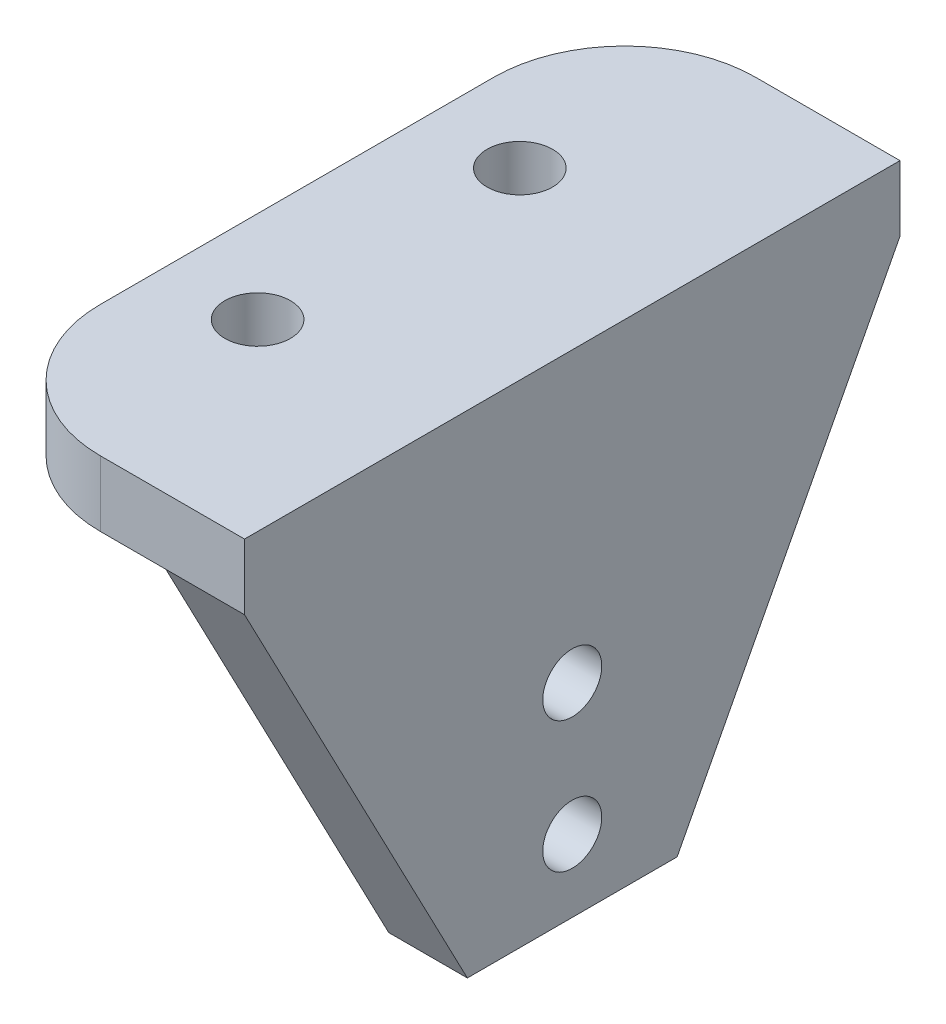
ISO-10303-21;
HEADER;
FILE_DESCRIPTION(('STEP AP214'),'2;1');
FILE_NAME('part.step','',(''),(''),'','','');
FILE_SCHEMA(('AUTOMOTIVE_DESIGN { 1 0 10303 214 1 1 1 1 }'));
ENDSEC;
DATA;
#1=APPLICATION_CONTEXT('core data for automotive mechanical design processes');
#2=APPLICATION_PROTOCOL_DEFINITION('international standard','automotive_design',2000,#1);
#3=PRODUCT_CONTEXT('',#1,'mechanical');
#4=PRODUCT('Part','Part','',(#3));
#5=PRODUCT_RELATED_PRODUCT_CATEGORY('part','',(#4));
#6=PRODUCT_DEFINITION_FORMATION('','',#4);
#7=PRODUCT_DEFINITION_CONTEXT('part definition',#1,'design');
#8=PRODUCT_DEFINITION('design','',#6,#7);
#9=PRODUCT_DEFINITION_SHAPE('','',#8);
#10=(LENGTH_UNIT() NAMED_UNIT(*) SI_UNIT(.MILLI.,.METRE.));
#11=(NAMED_UNIT(*) PLANE_ANGLE_UNIT() SI_UNIT($,.RADIAN.));
#12=(NAMED_UNIT(*) SI_UNIT($,.STERADIAN.) SOLID_ANGLE_UNIT());
#13=UNCERTAINTY_MEASURE_WITH_UNIT(LENGTH_MEASURE(1.E-05),#10,'distance_accuracy_value','');
#14=(GEOMETRIC_REPRESENTATION_CONTEXT(3) GLOBAL_UNCERTAINTY_ASSIGNED_CONTEXT((#13)) GLOBAL_UNIT_ASSIGNED_CONTEXT((#10,
#11,#12)) REPRESENTATION_CONTEXT('',''));
#15=CARTESIAN_POINT('',(0.,0.,0.));
#16=DIRECTION('',(0.,0.,1.));
#17=DIRECTION('',(1.,0.,0.));
#18=AXIS2_PLACEMENT_3D('',#15,#16,#17);
#19=CARTESIAN_POINT('',(0.,5.,0.));
#20=DIRECTION('',(1.,0.,0.));
#21=DIRECTION('',(0.,0.,-1.));
#22=AXIS2_PLACEMENT_3D('',#19,#20,#21);
#23=PLANE('',#22);
#24=DIRECTION('',(0.,0.,1.));
#25=VECTOR('',#24,1.);
#26=CARTESIAN_POINT('',(0.,0.,0.));
#27=LINE('',#26,#25);
#28=CARTESIAN_POINT('',(0.,0.,-40.));
#29=VERTEX_POINT('',#28);
#30=CARTESIAN_POINT('',(0.,0.,-10.));
#31=VERTEX_POINT('',#30);
#32=EDGE_CURVE('E156',#29,#31,#27,.T.);
#33=ORIENTED_EDGE('',*,*,#32,.T.);
#34=DIRECTION('',(0.,-1.,0.));
#35=VECTOR('',#34,1.);
#36=CARTESIAN_POINT('',(0.,5.,-10.));
#37=LINE('',#36,#35);
#38=CARTESIAN_POINT('',(0.,5.,-10.));
#39=VERTEX_POINT('',#38);
#40=EDGE_CURVE('E61',#31,#39,#37,.F.);
#41=ORIENTED_EDGE('',*,*,#40,.T.);
#42=DIRECTION('',(0.,0.,1.));
#43=VECTOR('',#42,1.);
#44=CARTESIAN_POINT('',(0.,5.,0.));
#45=LINE('',#44,#43);
#46=CARTESIAN_POINT('',(0.,5.,-40.));
#47=VERTEX_POINT('',#46);
#48=EDGE_CURVE('E164',#47,#39,#45,.T.);
#49=ORIENTED_EDGE('',*,*,#48,.F.);
#50=DIRECTION('',(0.,-1.,0.));
#51=VECTOR('',#50,1.);
#52=CARTESIAN_POINT('',(0.,5.,-40.));
#53=LINE('',#52,#51);
#54=EDGE_CURVE('E194',#47,#29,#53,.T.);
#55=ORIENTED_EDGE('',*,*,#54,.T.);
#56=EDGE_LOOP('',(#33,#41,#49,#55));
#57=FACE_BOUND('',#56,.T.);
#58=ADVANCED_FACE('F39',(#57),#23,.F.);
#59=CARTESIAN_POINT('',(0.,5.,0.));
#60=DIRECTION('',(0.,0.,-1.));
#61=DIRECTION('',(-1.,0.,0.));
#62=AXIS2_PLACEMENT_3D('',#59,#60,#61);
#63=PLANE('',#62);
#64=DIRECTION('',(1.,0.,0.));
#65=VECTOR('',#64,1.);
#66=CARTESIAN_POINT('',(0.,5.,0.));
#67=LINE('',#66,#65);
#68=CARTESIAN_POINT('',(10.,5.,0.));
#69=VERTEX_POINT('',#68);
#70=CARTESIAN_POINT('',(21.,5.,0.));
#71=VERTEX_POINT('',#70);
#72=EDGE_CURVE('E167',#69,#71,#67,.T.);
#73=ORIENTED_EDGE('',*,*,#72,.F.);
#74=DIRECTION('',(0.,-1.,0.));
#75=VECTOR('',#74,1.);
#76=CARTESIAN_POINT('',(10.,5.,0.));
#77=LINE('',#76,#75);
#78=CARTESIAN_POINT('',(10.,0.,0.));
#79=VERTEX_POINT('',#78);
#80=EDGE_CURVE('E173',#69,#79,#77,.T.);
#81=ORIENTED_EDGE('',*,*,#80,.T.);
#82=DIRECTION('',(1.,0.,0.));
#83=VECTOR('',#82,1.);
#84=CARTESIAN_POINT('',(0.,0.,0.));
#85=LINE('',#84,#83);
#86=CARTESIAN_POINT('',(15.,0.,0.));
#87=VERTEX_POINT('',#86);
#88=EDGE_CURVE('E176',#79,#87,#85,.T.);
#89=ORIENTED_EDGE('',*,*,#88,.T.);
#90=DIRECTION('',(-1.,0.,0.));
#91=VECTOR('',#90,1.);
#92=CARTESIAN_POINT('',(21.,0.,0.));
#93=LINE('',#92,#91);
#94=CARTESIAN_POINT('',(21.,0.,0.));
#95=VERTEX_POINT('',#94);
#96=EDGE_CURVE('E140',#95,#87,#93,.T.);
#97=ORIENTED_EDGE('',*,*,#96,.F.);
#98=DIRECTION('',(0.,-1.,0.));
#99=VECTOR('',#98,1.);
#100=CARTESIAN_POINT('',(21.,5.,0.));
#101=LINE('',#100,#99);
#102=EDGE_CURVE('E214',#71,#95,#101,.T.);
#103=ORIENTED_EDGE('',*,*,#102,.F.);
#104=EDGE_LOOP('',(#73,#81,#89,#97,#103));
#105=FACE_BOUND('',#104,.T.);
#106=ADVANCED_FACE('F211',(#105),#63,.F.);
#107=CARTESIAN_POINT('',(0.,5.,-50.));
#108=DIRECTION('',(0.,0.,1.));
#109=DIRECTION('',(1.,0.,0.));
#110=AXIS2_PLACEMENT_3D('',#107,#108,#109);
#111=PLANE('',#110);
#112=DIRECTION('',(-1.,0.,0.));
#113=VECTOR('',#112,1.);
#114=CARTESIAN_POINT('',(0.,0.,-50.));
#115=LINE('',#114,#113);
#116=CARTESIAN_POINT('',(15.,0.,-50.));
#117=VERTEX_POINT('',#116);
#118=CARTESIAN_POINT('',(10.,0.,-50.));
#119=VERTEX_POINT('',#118);
#120=EDGE_CURVE('E168',#117,#119,#115,.T.);
#121=ORIENTED_EDGE('',*,*,#120,.T.);
#122=DIRECTION('',(0.,-1.,0.));
#123=VECTOR('',#122,1.);
#124=CARTESIAN_POINT('',(10.,5.,-50.));
#125=LINE('',#124,#123);
#126=CARTESIAN_POINT('',(10.,5.,-50.));
#127=VERTEX_POINT('',#126);
#128=EDGE_CURVE('E11',#119,#127,#125,.F.);
#129=ORIENTED_EDGE('',*,*,#128,.T.);
#130=DIRECTION('',(-1.,0.,0.));
#131=VECTOR('',#130,1.);
#132=CARTESIAN_POINT('',(0.,5.,-50.));
#133=LINE('',#132,#131);
#134=CARTESIAN_POINT('',(21.,5.,-50.));
#135=VERTEX_POINT('',#134);
#136=EDGE_CURVE('E117',#135,#127,#133,.T.);
#137=ORIENTED_EDGE('',*,*,#136,.F.);
#138=DIRECTION('',(0.,1.,0.));
#139=VECTOR('',#138,1.);
#140=CARTESIAN_POINT('',(21.,5.,-50.));
#141=LINE('',#140,#139);
#142=CARTESIAN_POINT('',(21.,0.,-50.));
#143=VERTEX_POINT('',#142);
#144=EDGE_CURVE('E111',#143,#135,#141,.T.);
#145=ORIENTED_EDGE('',*,*,#144,.F.);
#146=DIRECTION('',(-1.,0.,0.));
#147=VECTOR('',#146,1.);
#148=CARTESIAN_POINT('',(21.,0.,-50.));
#149=LINE('',#148,#147);
#150=EDGE_CURVE('E115',#143,#117,#149,.T.);
#151=ORIENTED_EDGE('',*,*,#150,.T.);
#152=EDGE_LOOP('',(#121,#129,#137,#145,#151));
#153=FACE_BOUND('',#152,.T.);
#154=ADVANCED_FACE('F113',(#153),#111,.F.);
#155=CARTESIAN_POINT('',(0.,5.,0.));
#156=DIRECTION('',(0.,-1.,0.));
#157=DIRECTION('',(0.,0.,-1.));
#158=AXIS2_PLACEMENT_3D('',#155,#156,#157);
#159=PLANE('',#158);
#160=CARTESIAN_POINT('',(6.99999999999999,5.,-35.));
#161=DIRECTION('',(0.,1.,0.));
#162=DIRECTION('',(0.,0.,1.));
#163=AXIS2_PLACEMENT_3D('',#160,#161,#162);
#164=CIRCLE('',#163,2.5);
#165=CARTESIAN_POINT('',(6.99999999999999,5.,-32.5));
#166=VERTEX_POINT('',#165);
#167=EDGE_CURVE('E157',#166,#166,#164,.T.);
#168=ORIENTED_EDGE('',*,*,#167,.F.);
#169=EDGE_LOOP('',(#168));
#170=FACE_BOUND('',#169,.T.);
#171=CARTESIAN_POINT('',(6.99999999999999,5.,-15.));
#172=DIRECTION('',(0.,1.,0.));
#173=DIRECTION('',(0.,0.,1.));
#174=AXIS2_PLACEMENT_3D('',#171,#172,#173);
#175=CIRCLE('',#174,2.5);
#176=CARTESIAN_POINT('',(6.99999999999999,5.,-12.5));
#177=VERTEX_POINT('',#176);
#178=EDGE_CURVE('E139',#177,#177,#175,.T.);
#179=ORIENTED_EDGE('',*,*,#178,.F.);
#180=EDGE_LOOP('',(#179));
#181=FACE_BOUND('',#180,.T.);
#182=ORIENTED_EDGE('',*,*,#48,.T.);
#183=CARTESIAN_POINT('',(10.,5.,-10.));
#184=DIRECTION('',(0.,-1.,0.));
#185=DIRECTION('',(0.,0.,-1.));
#186=AXIS2_PLACEMENT_3D('',#183,#184,#185);
#187=CIRCLE('',#186,10.);
#188=EDGE_CURVE('E48',#39,#69,#187,.F.);
#189=ORIENTED_EDGE('',*,*,#188,.T.);
#190=ORIENTED_EDGE('',*,*,#72,.T.);
#191=DIRECTION('',(0.,0.,1.));
#192=VECTOR('',#191,1.);
#193=CARTESIAN_POINT('',(21.,5.,-50.));
#194=LINE('',#193,#192);
#195=EDGE_CURVE('E122',#135,#71,#194,.T.);
#196=ORIENTED_EDGE('',*,*,#195,.F.);
#197=ORIENTED_EDGE('',*,*,#136,.T.);
#198=CARTESIAN_POINT('',(10.,5.,-40.));
#199=DIRECTION('',(0.,-1.,0.));
#200=DIRECTION('',(0.,0.,-1.));
#201=AXIS2_PLACEMENT_3D('',#198,#199,#200);
#202=CIRCLE('',#201,10.);
#203=EDGE_CURVE('E200',#127,#47,#202,.F.);
#204=ORIENTED_EDGE('',*,*,#203,.T.);
#205=EDGE_LOOP('',(#182,#189,#190,#196,#197,#204));
#206=FACE_BOUND('',#205,.T.);
#207=ADVANCED_FACE('F206',(#170,#181,#206),#159,.F.);
#208=CARTESIAN_POINT('',(0.,0.,0.));
#209=DIRECTION('',(0.,-1.,0.));
#210=DIRECTION('',(0.,0.,-1.));
#211=AXIS2_PLACEMENT_3D('',#208,#209,#210);
#212=PLANE('',#211);
#213=CARTESIAN_POINT('',(6.99999999999999,0.,-35.));
#214=DIRECTION('',(0.,1.,0.));
#215=DIRECTION('',(0.,0.,1.));
#216=AXIS2_PLACEMENT_3D('',#213,#214,#215);
#217=CIRCLE('',#216,2.5);
#218=CARTESIAN_POINT('',(6.99999999999999,0.,-32.5));
#219=VERTEX_POINT('',#218);
#220=EDGE_CURVE('E152',#219,#219,#217,.T.);
#221=ORIENTED_EDGE('',*,*,#220,.T.);
#222=EDGE_LOOP('',(#221));
#223=FACE_BOUND('',#222,.T.);
#224=CARTESIAN_POINT('',(6.99999999999999,0.,-15.));
#225=DIRECTION('',(0.,1.,0.));
#226=DIRECTION('',(0.,0.,1.));
#227=AXIS2_PLACEMENT_3D('',#224,#225,#226);
#228=CIRCLE('',#227,2.5);
#229=CARTESIAN_POINT('',(6.99999999999999,0.,-12.5));
#230=VERTEX_POINT('',#229);
#231=EDGE_CURVE('E145',#230,#230,#228,.T.);
#232=ORIENTED_EDGE('',*,*,#231,.T.);
#233=EDGE_LOOP('',(#232));
#234=FACE_BOUND('',#233,.T.);
#235=ORIENTED_EDGE('',*,*,#88,.F.);
#236=CARTESIAN_POINT('',(10.,0.,-10.));
#237=DIRECTION('',(0.,-1.,0.));
#238=DIRECTION('',(0.,0.,-1.));
#239=AXIS2_PLACEMENT_3D('',#236,#237,#238);
#240=CIRCLE('',#239,10.);
#241=EDGE_CURVE('E191',#79,#31,#240,.T.);
#242=ORIENTED_EDGE('',*,*,#241,.T.);
#243=ORIENTED_EDGE('',*,*,#32,.F.);
#244=CARTESIAN_POINT('',(10.,0.,-40.));
#245=DIRECTION('',(0.,-1.,0.));
#246=DIRECTION('',(0.,0.,-1.));
#247=AXIS2_PLACEMENT_3D('',#244,#245,#246);
#248=CIRCLE('',#247,10.);
#249=EDGE_CURVE('E188',#29,#119,#248,.T.);
#250=ORIENTED_EDGE('',*,*,#249,.T.);
#251=ORIENTED_EDGE('',*,*,#120,.F.);
#252=DIRECTION('',(0.,0.,-1.));
#253=VECTOR('',#252,1.);
#254=CARTESIAN_POINT('',(15.,0.,0.));
#255=LINE('',#254,#253);
#256=EDGE_CURVE('E179',#87,#117,#255,.T.);
#257=ORIENTED_EDGE('',*,*,#256,.F.);
#258=EDGE_LOOP('',(#235,#242,#243,#250,#251,#257));
#259=FACE_BOUND('',#258,.T.);
#260=ADVANCED_FACE('F218',(#223,#234,#259),#212,.T.);
#261=CARTESIAN_POINT('',(6.99999999999999,0.,-15.));
#262=DIRECTION('',(0.,1.,0.));
#263=DIRECTION('',(0.,0.,1.));
#264=AXIS2_PLACEMENT_3D('',#261,#262,#263);
#265=CYLINDRICAL_SURFACE('',#264,2.5);
#266=ORIENTED_EDGE('',*,*,#231,.F.);
#267=EDGE_LOOP('',(#266));
#268=FACE_BOUND('',#267,.T.);
#269=ORIENTED_EDGE('',*,*,#178,.T.);
#270=EDGE_LOOP('',(#269));
#271=FACE_BOUND('',#270,.T.);
#272=ADVANCED_FACE('F334',(#268,#271),#265,.F.);
#273=CARTESIAN_POINT('',(6.99999999999999,0.,-35.));
#274=DIRECTION('',(0.,1.,0.));
#275=DIRECTION('',(0.,0.,1.));
#276=AXIS2_PLACEMENT_3D('',#273,#274,#275);
#277=CYLINDRICAL_SURFACE('',#276,2.5);
#278=ORIENTED_EDGE('',*,*,#220,.F.);
#279=EDGE_LOOP('',(#278));
#280=FACE_BOUND('',#279,.T.);
#281=ORIENTED_EDGE('',*,*,#167,.T.);
#282=EDGE_LOOP('',(#281));
#283=FACE_BOUND('',#282,.T.);
#284=ADVANCED_FACE('F330',(#280,#283),#277,.F.);
#285=CARTESIAN_POINT('',(10.,5.,-10.));
#286=DIRECTION('',(0.,-1.,0.));
#287=DIRECTION('',(0.,0.,-1.));
#288=AXIS2_PLACEMENT_3D('',#285,#286,#287);
#289=CYLINDRICAL_SURFACE('',#288,10.);
#290=ORIENTED_EDGE('',*,*,#188,.F.);
#291=ORIENTED_EDGE('',*,*,#40,.F.);
#292=ORIENTED_EDGE('',*,*,#241,.F.);
#293=ORIENTED_EDGE('',*,*,#80,.F.);
#294=EDGE_LOOP('',(#290,#291,#292,#293));
#295=FACE_BOUND('',#294,.T.);
#296=ADVANCED_FACE('F215',(#295),#289,.T.);
#297=CARTESIAN_POINT('',(10.,5.,-40.));
#298=DIRECTION('',(0.,-1.,0.));
#299=DIRECTION('',(0.,0.,-1.));
#300=AXIS2_PLACEMENT_3D('',#297,#298,#299);
#301=CYLINDRICAL_SURFACE('',#300,10.);
#302=ORIENTED_EDGE('',*,*,#203,.F.);
#303=ORIENTED_EDGE('',*,*,#128,.F.);
#304=ORIENTED_EDGE('',*,*,#249,.F.);
#305=ORIENTED_EDGE('',*,*,#54,.F.);
#306=EDGE_LOOP('',(#302,#303,#304,#305));
#307=FACE_BOUND('',#306,.T.);
#308=ADVANCED_FACE('F41',(#307),#301,.T.);
#309=CARTESIAN_POINT('',(15.,0.,0.));
#310=DIRECTION('',(1.,0.,0.));
#311=DIRECTION('',(0.,0.,-1.));
#312=AXIS2_PLACEMENT_3D('',#309,#310,#311);
#313=PLANE('',#312);
#314=CARTESIAN_POINT('',(15.,-27.,-25.));
#315=DIRECTION('',(-1.,0.,0.));
#316=DIRECTION('',(0.,0.,1.));
#317=AXIS2_PLACEMENT_3D('',#314,#315,#316);
#318=CIRCLE('',#317,4.025);
#319=CARTESIAN_POINT('',(15.,-27.,-20.975));
#320=VERTEX_POINT('',#319);
#321=EDGE_CURVE('E291',#320,#320,#318,.T.);
#322=ORIENTED_EDGE('',*,*,#321,.F.);
#323=EDGE_LOOP('',(#322));
#324=FACE_BOUND('',#323,.T.);
#325=CARTESIAN_POINT('',(15.,-17.,-25.));
#326=DIRECTION('',(-1.,0.,0.));
#327=DIRECTION('',(0.,0.,1.));
#328=AXIS2_PLACEMENT_3D('',#325,#326,#327);
#329=CIRCLE('',#328,4.025);
#330=CARTESIAN_POINT('',(15.,-17.,-20.975));
#331=VERTEX_POINT('',#330);
#332=EDGE_CURVE('E271',#331,#331,#329,.T.);
#333=ORIENTED_EDGE('',*,*,#332,.F.);
#334=EDGE_LOOP('',(#333));
#335=FACE_BOUND('',#334,.T.);
#336=DIRECTION('',(0.,-0.88609821280882,-0.463497526699998));
#337=VECTOR('',#336,1.);
#338=CARTESIAN_POINT('',(15.,0.,0.));
#339=LINE('',#338,#337);
#340=CARTESIAN_POINT('',(15.,-32.5,-17.));
#341=VERTEX_POINT('',#340);
#342=EDGE_CURVE('E227',#87,#341,#339,.T.);
#343=ORIENTED_EDGE('',*,*,#342,.F.);
#344=ORIENTED_EDGE('',*,*,#256,.T.);
#345=DIRECTION('',(0.,0.88609821280882,-0.463497526699998));
#346=VECTOR('',#345,1.);
#347=CARTESIAN_POINT('',(15.,0.,-50.));
#348=LINE('',#347,#346);
#349=CARTESIAN_POINT('',(15.,-32.5,-33.));
#350=VERTEX_POINT('',#349);
#351=EDGE_CURVE('E137',#350,#117,#348,.T.);
#352=ORIENTED_EDGE('',*,*,#351,.F.);
#353=DIRECTION('',(0.,0.,-1.));
#354=VECTOR('',#353,1.);
#355=CARTESIAN_POINT('',(15.,-32.5,-17.));
#356=LINE('',#355,#354);
#357=EDGE_CURVE('E133',#341,#350,#356,.T.);
#358=ORIENTED_EDGE('',*,*,#357,.F.);
#359=EDGE_LOOP('',(#343,#344,#352,#358));
#360=FACE_BOUND('',#359,.T.);
#361=ADVANCED_FACE('F225',(#324,#335,#360),#313,.F.);
#362=CARTESIAN_POINT('',(21.,0.,-50.));
#363=DIRECTION('',(0.,0.463497526699998,0.88609821280882));
#364=DIRECTION('',(0.,-0.88609821280882,0.463497526699998));
#365=AXIS2_PLACEMENT_3D('',#362,#363,#364);
#366=PLANE('',#365);
#367=ORIENTED_EDGE('',*,*,#351,.T.);
#368=ORIENTED_EDGE('',*,*,#150,.F.);
#369=DIRECTION('',(0.,0.88609821280882,-0.463497526699998));
#370=VECTOR('',#369,1.);
#371=CARTESIAN_POINT('',(21.,0.,-50.));
#372=LINE('',#371,#370);
#373=CARTESIAN_POINT('',(21.,-32.5,-33.));
#374=VERTEX_POINT('',#373);
#375=EDGE_CURVE('E123',#374,#143,#372,.T.);
#376=ORIENTED_EDGE('',*,*,#375,.F.);
#377=DIRECTION('',(-1.,0.,0.));
#378=VECTOR('',#377,1.);
#379=CARTESIAN_POINT('',(21.,-32.5,-33.));
#380=LINE('',#379,#378);
#381=EDGE_CURVE('E240',#374,#350,#380,.T.);
#382=ORIENTED_EDGE('',*,*,#381,.T.);
#383=EDGE_LOOP('',(#367,#368,#376,#382));
#384=FACE_BOUND('',#383,.T.);
#385=ADVANCED_FACE('F135',(#384),#366,.F.);
#386=CARTESIAN_POINT('',(21.,0.,0.));
#387=DIRECTION('',(0.,0.463497526699998,-0.88609821280882));
#388=DIRECTION('',(0.,0.88609821280882,0.463497526699998));
#389=AXIS2_PLACEMENT_3D('',#386,#387,#388);
#390=PLANE('',#389);
#391=ORIENTED_EDGE('',*,*,#342,.T.);
#392=DIRECTION('',(-1.,0.,0.));
#393=VECTOR('',#392,1.);
#394=CARTESIAN_POINT('',(21.,-32.5,-17.));
#395=LINE('',#394,#393);
#396=CARTESIAN_POINT('',(21.,-32.5,-17.));
#397=VERTEX_POINT('',#396);
#398=EDGE_CURVE('E148',#397,#341,#395,.T.);
#399=ORIENTED_EDGE('',*,*,#398,.F.);
#400=DIRECTION('',(0.,-0.88609821280882,-0.463497526699998));
#401=VECTOR('',#400,1.);
#402=CARTESIAN_POINT('',(21.,0.,0.));
#403=LINE('',#402,#401);
#404=EDGE_CURVE('E247',#95,#397,#403,.T.);
#405=ORIENTED_EDGE('',*,*,#404,.F.);
#406=ORIENTED_EDGE('',*,*,#96,.T.);
#407=EDGE_LOOP('',(#391,#399,#405,#406));
#408=FACE_BOUND('',#407,.T.);
#409=ADVANCED_FACE('F246',(#408),#390,.F.);
#410=CARTESIAN_POINT('',(21.,-32.5,-17.));
#411=DIRECTION('',(0.,1.,0.));
#412=DIRECTION('',(0.,0.,1.));
#413=AXIS2_PLACEMENT_3D('',#410,#411,#412);
#414=PLANE('',#413);
#415=ORIENTED_EDGE('',*,*,#357,.T.);
#416=ORIENTED_EDGE('',*,*,#381,.F.);
#417=DIRECTION('',(0.,0.,-1.));
#418=VECTOR('',#417,1.);
#419=CARTESIAN_POINT('',(21.,-32.5,-17.));
#420=LINE('',#419,#418);
#421=EDGE_CURVE('E128',#397,#374,#420,.T.);
#422=ORIENTED_EDGE('',*,*,#421,.F.);
#423=ORIENTED_EDGE('',*,*,#398,.T.);
#424=EDGE_LOOP('',(#415,#416,#422,#423));
#425=FACE_BOUND('',#424,.T.);
#426=ADVANCED_FACE('F244',(#425),#414,.F.);
#427=CARTESIAN_POINT('',(21.,0.,0.));
#428=DIRECTION('',(1.,0.,0.));
#429=DIRECTION('',(0.,0.,-1.));
#430=AXIS2_PLACEMENT_3D('',#427,#428,#429);
#431=PLANE('',#430);
#432=CARTESIAN_POINT('',(21.,-27.,-25.));
#433=DIRECTION('',(-1.,0.,0.));
#434=DIRECTION('',(0.,0.,1.));
#435=AXIS2_PLACEMENT_3D('',#432,#433,#434);
#436=CIRCLE('',#435,2.25);
#437=CARTESIAN_POINT('',(21.,-27.,-22.75));
#438=VERTEX_POINT('',#437);
#439=EDGE_CURVE('E275',#438,#438,#436,.T.);
#440=ORIENTED_EDGE('',*,*,#439,.T.);
#441=EDGE_LOOP('',(#440));
#442=FACE_BOUND('',#441,.T.);
#443=CARTESIAN_POINT('',(21.,-17.,-25.));
#444=DIRECTION('',(-1.,0.,0.));
#445=DIRECTION('',(0.,0.,1.));
#446=AXIS2_PLACEMENT_3D('',#443,#444,#445);
#447=CIRCLE('',#446,2.25);
#448=CARTESIAN_POINT('',(21.,-17.,-22.75));
#449=VERTEX_POINT('',#448);
#450=EDGE_CURVE('E236',#449,#449,#447,.T.);
#451=ORIENTED_EDGE('',*,*,#450,.T.);
#452=EDGE_LOOP('',(#451));
#453=FACE_BOUND('',#452,.T.);
#454=ORIENTED_EDGE('',*,*,#375,.T.);
#455=ORIENTED_EDGE('',*,*,#144,.T.);
#456=ORIENTED_EDGE('',*,*,#195,.T.);
#457=ORIENTED_EDGE('',*,*,#102,.T.);
#458=ORIENTED_EDGE('',*,*,#404,.T.);
#459=ORIENTED_EDGE('',*,*,#421,.T.);
#460=EDGE_LOOP('',(#454,#455,#456,#457,#458,#459));
#461=FACE_BOUND('',#460,.T.);
#462=ADVANCED_FACE('F126',(#442,#453,#461),#431,.T.);
#463=CARTESIAN_POINT('',(15.,-17.,-25.));
#464=DIRECTION('',(-1.,0.,0.));
#465=DIRECTION('',(0.,0.,1.));
#466=AXIS2_PLACEMENT_3D('',#463,#464,#465);
#467=CYLINDRICAL_SURFACE('',#466,2.25);
#468=ORIENTED_EDGE('',*,*,#450,.F.);
#469=EDGE_LOOP('',(#468));
#470=FACE_BOUND('',#469,.T.);
#471=CARTESIAN_POINT('',(17.6,-17.,-25.));
#472=DIRECTION('',(-1.,0.,0.));
#473=DIRECTION('',(0.,0.,1.));
#474=AXIS2_PLACEMENT_3D('',#471,#472,#473);
#475=CIRCLE('',#474,2.25);
#476=CARTESIAN_POINT('',(17.6,-17.,-22.75));
#477=VERTEX_POINT('',#476);
#478=EDGE_CURVE('E259',#477,#477,#475,.T.);
#479=ORIENTED_EDGE('',*,*,#478,.T.);
#480=EDGE_LOOP('',(#479));
#481=FACE_BOUND('',#480,.T.);
#482=ADVANCED_FACE('F386',(#470,#481),#467,.F.);
#483=CARTESIAN_POINT('',(17.6,-13.,-25.));
#484=DIRECTION('',(1.,0.,0.));
#485=DIRECTION('',(0.,0.,-1.));
#486=AXIS2_PLACEMENT_3D('',#483,#484,#485);
#487=PLANE('',#486);
#488=ORIENTED_EDGE('',*,*,#478,.F.);
#489=EDGE_LOOP('',(#488));
#490=FACE_BOUND('',#489,.T.);
#491=CARTESIAN_POINT('',(17.6,-17.,-25.));
#492=DIRECTION('',(-1.,0.,0.));
#493=DIRECTION('',(0.,0.,1.));
#494=AXIS2_PLACEMENT_3D('',#491,#492,#493);
#495=CIRCLE('',#494,4.);
#496=CARTESIAN_POINT('',(17.6,-17.,-21.));
#497=VERTEX_POINT('',#496);
#498=EDGE_CURVE('E263',#497,#497,#495,.T.);
#499=ORIENTED_EDGE('',*,*,#498,.T.);
#500=EDGE_LOOP('',(#499));
#501=FACE_BOUND('',#500,.T.);
#502=ADVANCED_FACE('F316',(#490,#501),#487,.F.);
#503=CARTESIAN_POINT('',(15.,-17.,-25.));
#504=DIRECTION('',(-1.,0.,0.));
#505=DIRECTION('',(0.,0.,1.));
#506=AXIS2_PLACEMENT_3D('',#503,#504,#505);
#507=CYLINDRICAL_SURFACE('',#506,4.);
#508=ORIENTED_EDGE('',*,*,#498,.F.);
#509=EDGE_LOOP('',(#508));
#510=FACE_BOUND('',#509,.T.);
#511=CARTESIAN_POINT('',(15.025,-17.,-25.));
#512=DIRECTION('',(-1.,0.,0.));
#513=DIRECTION('',(0.,0.,1.));
#514=AXIS2_PLACEMENT_3D('',#511,#512,#513);
#515=CIRCLE('',#514,4.);
#516=CARTESIAN_POINT('',(15.025,-17.,-21.));
#517=VERTEX_POINT('',#516);
#518=EDGE_CURVE('E267',#517,#517,#515,.T.);
#519=ORIENTED_EDGE('',*,*,#518,.T.);
#520=EDGE_LOOP('',(#519));
#521=FACE_BOUND('',#520,.T.);
#522=ADVANCED_FACE('F306',(#510,#521),#507,.F.);
#523=CARTESIAN_POINT('',(15.,-17.,-25.));
#524=DIRECTION('',(-1.,0.,0.));
#525=DIRECTION('',(0.,0.,1.));
#526=AXIS2_PLACEMENT_3D('',#523,#524,#525);
#527=CONICAL_SURFACE('',#526,4.025,0.785398163397448);
#528=ORIENTED_EDGE('',*,*,#518,.F.);
#529=EDGE_LOOP('',(#528));
#530=FACE_BOUND('',#529,.T.);
#531=ORIENTED_EDGE('',*,*,#332,.T.);
#532=EDGE_LOOP('',(#531));
#533=FACE_BOUND('',#532,.T.);
#534=ADVANCED_FACE('F303',(#530,#533),#527,.F.);
#535=CARTESIAN_POINT('',(15.,-27.,-25.));
#536=DIRECTION('',(-1.,0.,0.));
#537=DIRECTION('',(0.,0.,1.));
#538=AXIS2_PLACEMENT_3D('',#535,#536,#537);
#539=CYLINDRICAL_SURFACE('',#538,2.25);
#540=ORIENTED_EDGE('',*,*,#439,.F.);
#541=EDGE_LOOP('',(#540));
#542=FACE_BOUND('',#541,.T.);
#543=CARTESIAN_POINT('',(17.6,-27.,-25.));
#544=DIRECTION('',(-1.,0.,0.));
#545=DIRECTION('',(0.,0.,1.));
#546=AXIS2_PLACEMENT_3D('',#543,#544,#545);
#547=CIRCLE('',#546,2.25);
#548=CARTESIAN_POINT('',(17.6,-27.,-22.75));
#549=VERTEX_POINT('',#548);
#550=EDGE_CURVE('E279',#549,#549,#547,.T.);
#551=ORIENTED_EDGE('',*,*,#550,.T.);
#552=EDGE_LOOP('',(#551));
#553=FACE_BOUND('',#552,.T.);
#554=ADVANCED_FACE('F305',(#542,#553),#539,.F.);
#555=CARTESIAN_POINT('',(17.6,-23.,-25.));
#556=DIRECTION('',(1.,0.,0.));
#557=DIRECTION('',(0.,0.,-1.));
#558=AXIS2_PLACEMENT_3D('',#555,#556,#557);
#559=PLANE('',#558);
#560=ORIENTED_EDGE('',*,*,#550,.F.);
#561=EDGE_LOOP('',(#560));
#562=FACE_BOUND('',#561,.T.);
#563=CARTESIAN_POINT('',(17.6,-27.,-25.));
#564=DIRECTION('',(-1.,0.,0.));
#565=DIRECTION('',(0.,0.,1.));
#566=AXIS2_PLACEMENT_3D('',#563,#564,#565);
#567=CIRCLE('',#566,4.);
#568=CARTESIAN_POINT('',(17.6,-27.,-21.));
#569=VERTEX_POINT('',#568);
#570=EDGE_CURVE('E283',#569,#569,#567,.T.);
#571=ORIENTED_EDGE('',*,*,#570,.T.);
#572=EDGE_LOOP('',(#571));
#573=FACE_BOUND('',#572,.T.);
#574=ADVANCED_FACE('F313',(#562,#573),#559,.F.);
#575=CARTESIAN_POINT('',(15.,-27.,-25.));
#576=DIRECTION('',(-1.,0.,0.));
#577=DIRECTION('',(0.,0.,1.));
#578=AXIS2_PLACEMENT_3D('',#575,#576,#577);
#579=CYLINDRICAL_SURFACE('',#578,4.);
#580=ORIENTED_EDGE('',*,*,#570,.F.);
#581=EDGE_LOOP('',(#580));
#582=FACE_BOUND('',#581,.T.);
#583=CARTESIAN_POINT('',(15.025,-27.,-25.));
#584=DIRECTION('',(-1.,0.,0.));
#585=DIRECTION('',(0.,0.,1.));
#586=AXIS2_PLACEMENT_3D('',#583,#584,#585);
#587=CIRCLE('',#586,4.);
#588=CARTESIAN_POINT('',(15.025,-27.,-21.));
#589=VERTEX_POINT('',#588);
#590=EDGE_CURVE('E287',#589,#589,#587,.T.);
#591=ORIENTED_EDGE('',*,*,#590,.T.);
#592=EDGE_LOOP('',(#591));
#593=FACE_BOUND('',#592,.T.);
#594=ADVANCED_FACE('F425',(#582,#593),#579,.F.);
#595=CARTESIAN_POINT('',(15.,-27.,-25.));
#596=DIRECTION('',(-1.,0.,0.));
#597=DIRECTION('',(0.,0.,1.));
#598=AXIS2_PLACEMENT_3D('',#595,#596,#597);
#599=CONICAL_SURFACE('',#598,4.025,0.785398163397414);
#600=ORIENTED_EDGE('',*,*,#590,.F.);
#601=EDGE_LOOP('',(#600));
#602=FACE_BOUND('',#601,.T.);
#603=ORIENTED_EDGE('',*,*,#321,.T.);
#604=EDGE_LOOP('',(#603));
#605=FACE_BOUND('',#604,.T.);
#606=ADVANCED_FACE('F296',(#602,#605),#599,.F.);
#607=CLOSED_SHELL('',(#58,#106,#154,#207,#260,#272,#284,#296,#308,#361,#385,#409,#426,#462,#482,
#502,#522,#534,#554,#574,#594,#606));
#608=MANIFOLD_SOLID_BREP('B2',#607);
#609=ADVANCED_BREP_SHAPE_REPRESENTATION('',(#18,#608),#14);
#610=SHAPE_DEFINITION_REPRESENTATION(#9,#609);
ENDSEC;
END-ISO-10303-21;
